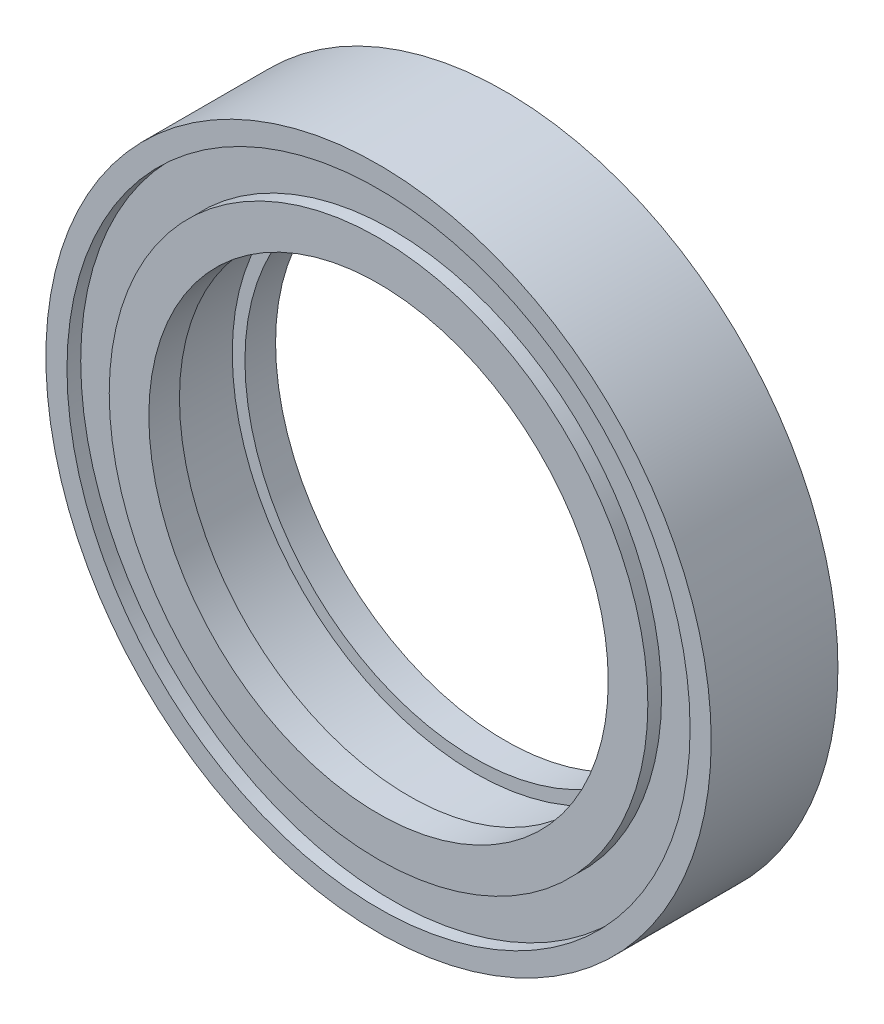
ISO-10303-21;
HEADER;
FILE_DESCRIPTION(('STEP AP214'),'2;1');
FILE_NAME('part.step','',(''),(''),'','','');
FILE_SCHEMA(('AUTOMOTIVE_DESIGN { 1 0 10303 214 1 1 1 1 }'));
ENDSEC;
DATA;
#1=APPLICATION_CONTEXT('core data for automotive mechanical design processes');
#2=APPLICATION_PROTOCOL_DEFINITION('international standard','automotive_design',2000,#1);
#3=PRODUCT_CONTEXT('',#1,'mechanical');
#4=PRODUCT('Part','Part','',(#3));
#5=PRODUCT_RELATED_PRODUCT_CATEGORY('part','',(#4));
#6=PRODUCT_DEFINITION_FORMATION('','',#4);
#7=PRODUCT_DEFINITION_CONTEXT('part definition',#1,'design');
#8=PRODUCT_DEFINITION('design','',#6,#7);
#9=PRODUCT_DEFINITION_SHAPE('','',#8);
#10=(LENGTH_UNIT() NAMED_UNIT(*) SI_UNIT(.MILLI.,.METRE.));
#11=(NAMED_UNIT(*) PLANE_ANGLE_UNIT() SI_UNIT($,.RADIAN.));
#12=(NAMED_UNIT(*) SI_UNIT($,.STERADIAN.) SOLID_ANGLE_UNIT());
#13=UNCERTAINTY_MEASURE_WITH_UNIT(LENGTH_MEASURE(1.E-05),#10,'distance_accuracy_value','');
#14=(GEOMETRIC_REPRESENTATION_CONTEXT(3) GLOBAL_UNCERTAINTY_ASSIGNED_CONTEXT((#13)) GLOBAL_UNIT_ASSIGNED_CONTEXT((#10,
#11,#12)) REPRESENTATION_CONTEXT('',''));
#15=CARTESIAN_POINT('',(0.,0.,0.));
#16=DIRECTION('',(0.,0.,1.));
#17=DIRECTION('',(1.,0.,0.));
#18=AXIS2_PLACEMENT_3D('',#15,#16,#17);
#19=CARTESIAN_POINT('',(3.43024899888577E-12,0.,1000.));
#20=DIRECTION('',(0.,0.,1.));
#21=DIRECTION('',(1.,0.,0.));
#22=AXIS2_PLACEMENT_3D('',#19,#20,#21);
#23=CYLINDRICAL_SURFACE('',#22,315.);
#24=CARTESIAN_POINT('',(2.05814939933142E-13,0.,59.9999999999989));
#25=DIRECTION('',(0.,0.,1.));
#26=DIRECTION('',(1.,0.,0.));
#27=AXIS2_PLACEMENT_3D('',#24,#25,#26);
#28=CIRCLE('',#27,315.);
#29=CARTESIAN_POINT('',(315.,0.,59.9999999999979));
#30=VERTEX_POINT('',#29);
#31=EDGE_CURVE('E87',#30,#30,#28,.T.);
#32=ORIENTED_EDGE('',*,*,#31,.F.);
#33=EDGE_LOOP('',(#32));
#34=FACE_BOUND('',#33,.T.);
#35=CARTESIAN_POINT('',(-2.0581493993315E-13,0.,-60.0000000000012));
#36=DIRECTION('',(0.,0.,1.));
#37=DIRECTION('',(1.,0.,0.));
#38=AXIS2_PLACEMENT_3D('',#35,#36,#37);
#39=CIRCLE('',#38,314.999999999999);
#40=CARTESIAN_POINT('',(314.999999999999,0.,-60.0000000000022));
#41=VERTEX_POINT('',#40);
#42=EDGE_CURVE('E10',#41,#41,#39,.T.);
#43=ORIENTED_EDGE('',*,*,#42,.T.);
#44=EDGE_LOOP('',(#43));
#45=FACE_BOUND('',#44,.T.);
#46=ADVANCED_FACE('F35',(#34,#45),#23,.T.);
#47=CARTESIAN_POINT('',(-315.,0.,-60.));
#48=DIRECTION('',(0.,0.,1.));
#49=DIRECTION('',(1.,0.,0.));
#50=AXIS2_PLACEMENT_3D('',#47,#48,#49);
#51=PLANE('',#50);
#52=ORIENTED_EDGE('',*,*,#42,.F.);
#53=EDGE_LOOP('',(#52));
#54=FACE_BOUND('',#53,.T.);
#55=CARTESIAN_POINT('',(-2.0581493993315E-13,0.,-60.0000000000012));
#56=DIRECTION('',(0.,0.,1.));
#57=DIRECTION('',(1.,0.,0.));
#58=AXIS2_PLACEMENT_3D('',#55,#56,#57);
#59=CIRCLE('',#58,294.999999999999);
#60=CARTESIAN_POINT('',(294.999999999999,0.,-60.0000000000022));
#61=VERTEX_POINT('',#60);
#62=EDGE_CURVE('E41',#61,#61,#59,.T.);
#63=ORIENTED_EDGE('',*,*,#62,.T.);
#64=EDGE_LOOP('',(#63));
#65=FACE_BOUND('',#64,.T.);
#66=ADVANCED_FACE('F94',(#54,#65),#51,.F.);
#67=CARTESIAN_POINT('',(3.43024899888577E-12,0.,1000.));
#68=DIRECTION('',(0.,0.,1.));
#69=DIRECTION('',(1.,0.,0.));
#70=AXIS2_PLACEMENT_3D('',#67,#68,#69);
#71=CYLINDRICAL_SURFACE('',#70,294.999999999999);
#72=ORIENTED_EDGE('',*,*,#62,.F.);
#73=EDGE_LOOP('',(#72));
#74=FACE_BOUND('',#73,.T.);
#75=CARTESIAN_POINT('',(-1.61221702947636E-13,0.,-47.0000000000015));
#76=DIRECTION('',(0.,0.,1.));
#77=DIRECTION('',(1.,0.,0.));
#78=AXIS2_PLACEMENT_3D('',#75,#76,#77);
#79=CIRCLE('',#78,294.999999999999);
#80=CARTESIAN_POINT('',(294.999999999999,0.,-47.0000000000025));
#81=VERTEX_POINT('',#80);
#82=EDGE_CURVE('E45',#81,#81,#79,.T.);
#83=ORIENTED_EDGE('',*,*,#82,.T.);
#84=EDGE_LOOP('',(#83));
#85=FACE_BOUND('',#84,.T.);
#86=ADVANCED_FACE('F98',(#74,#85),#71,.F.);
#87=CARTESIAN_POINT('',(-295.,0.,-47.0000000000002));
#88=DIRECTION('',(0.,0.,1.));
#89=DIRECTION('',(1.,0.,0.));
#90=AXIS2_PLACEMENT_3D('',#87,#88,#89);
#91=PLANE('',#90);
#92=ORIENTED_EDGE('',*,*,#82,.F.);
#93=EDGE_LOOP('',(#92));
#94=FACE_BOUND('',#93,.T.);
#95=CARTESIAN_POINT('',(-1.61221702947635E-13,0.,-47.0000000000013));
#96=DIRECTION('',(0.,0.,1.));
#97=DIRECTION('',(1.,0.,0.));
#98=AXIS2_PLACEMENT_3D('',#95,#96,#97);
#99=CIRCLE('',#98,255.);
#100=CARTESIAN_POINT('',(254.999999999999,0.,-47.0000000000021));
#101=VERTEX_POINT('',#100);
#102=EDGE_CURVE('E49',#101,#101,#99,.T.);
#103=ORIENTED_EDGE('',*,*,#102,.T.);
#104=EDGE_LOOP('',(#103));
#105=FACE_BOUND('',#104,.T.);
#106=ADVANCED_FACE('F103',(#94,#105),#91,.F.);
#107=CARTESIAN_POINT('',(3.43024899888577E-12,0.,1000.));
#108=DIRECTION('',(0.,0.,1.));
#109=DIRECTION('',(1.,0.,0.));
#110=AXIS2_PLACEMENT_3D('',#107,#108,#109);
#111=CYLINDRICAL_SURFACE('',#110,255.);
#112=ORIENTED_EDGE('',*,*,#102,.F.);
#113=EDGE_LOOP('',(#112));
#114=FACE_BOUND('',#113,.T.);
#115=CARTESIAN_POINT('',(-2.0581493993315E-13,0.,-60.0000000000009));
#116=DIRECTION('',(0.,0.,1.));
#117=DIRECTION('',(1.,0.,0.));
#118=AXIS2_PLACEMENT_3D('',#115,#116,#117);
#119=CIRCLE('',#118,255.);
#120=CARTESIAN_POINT('',(254.999999999999,0.,-60.0000000000018));
#121=VERTEX_POINT('',#120);
#122=EDGE_CURVE('E54',#121,#121,#119,.T.);
#123=ORIENTED_EDGE('',*,*,#122,.T.);
#124=EDGE_LOOP('',(#123));
#125=FACE_BOUND('',#124,.T.);
#126=ADVANCED_FACE('F109',(#114,#125),#111,.T.);
#127=CARTESIAN_POINT('',(-255.,0.,-59.9999999999999));
#128=DIRECTION('',(0.,0.,1.));
#129=DIRECTION('',(1.,0.,0.));
#130=AXIS2_PLACEMENT_3D('',#127,#128,#129);
#131=PLANE('',#130);
#132=ORIENTED_EDGE('',*,*,#122,.F.);
#133=EDGE_LOOP('',(#132));
#134=FACE_BOUND('',#133,.T.);
#135=CARTESIAN_POINT('',(-2.05814939933149E-13,0.,-60.0000000000007));
#136=DIRECTION('',(0.,0.,1.));
#137=DIRECTION('',(1.,0.,0.));
#138=AXIS2_PLACEMENT_3D('',#135,#136,#137);
#139=CIRCLE('',#138,217.499999999999);
#140=CARTESIAN_POINT('',(217.499999999999,0.,-60.0000000000015));
#141=VERTEX_POINT('',#140);
#142=EDGE_CURVE('E57',#141,#141,#139,.T.);
#143=ORIENTED_EDGE('',*,*,#142,.T.);
#144=EDGE_LOOP('',(#143));
#145=FACE_BOUND('',#144,.T.);
#146=ADVANCED_FACE('F113',(#134,#145),#131,.F.);
#147=CARTESIAN_POINT('',(3.43024899888577E-12,0.,1000.));
#148=DIRECTION('',(0.,0.,1.));
#149=DIRECTION('',(1.,0.,0.));
#150=AXIS2_PLACEMENT_3D('',#147,#148,#149);
#151=CYLINDRICAL_SURFACE('',#150,217.5);
#152=ORIENTED_EDGE('',*,*,#142,.F.);
#153=EDGE_LOOP('',(#152));
#154=FACE_BOUND('',#153,.T.);
#155=CARTESIAN_POINT('',(-1.06337718965461E-13,0.,-31.0000000000006));
#156=DIRECTION('',(0.,0.,1.));
#157=DIRECTION('',(1.,0.,0.));
#158=AXIS2_PLACEMENT_3D('',#155,#156,#157);
#159=CIRCLE('',#158,217.5);
#160=CARTESIAN_POINT('',(217.499999999999,0.,-31.0000000000013));
#161=VERTEX_POINT('',#160);
#162=EDGE_CURVE('E60',#161,#161,#159,.T.);
#163=ORIENTED_EDGE('',*,*,#162,.T.);
#164=EDGE_LOOP('',(#163));
#165=FACE_BOUND('',#164,.T.);
#166=ADVANCED_FACE('F117',(#154,#165),#151,.F.);
#167=CARTESIAN_POINT('',(-217.5,0.,-31.));
#168=DIRECTION('',(0.,0.,-1.));
#169=DIRECTION('',(-1.,0.,0.));
#170=AXIS2_PLACEMENT_3D('',#167,#168,#169);
#171=PLANE('',#170);
#172=ORIENTED_EDGE('',*,*,#162,.F.);
#173=EDGE_LOOP('',(#172));
#174=FACE_BOUND('',#173,.T.);
#175=CARTESIAN_POINT('',(-1.06337718965461E-13,0.,-31.0000000000008));
#176=DIRECTION('',(0.,0.,1.));
#177=DIRECTION('',(1.,0.,0.));
#178=AXIS2_PLACEMENT_3D('',#175,#176,#177);
#179=CIRCLE('',#178,229.5);
#180=CARTESIAN_POINT('',(229.499999999999,0.,-31.0000000000016));
#181=VERTEX_POINT('',#180);
#182=EDGE_CURVE('E63',#181,#181,#179,.T.);
#183=ORIENTED_EDGE('',*,*,#182,.T.);
#184=EDGE_LOOP('',(#183));
#185=FACE_BOUND('',#184,.T.);
#186=ADVANCED_FACE('F121',(#174,#185),#171,.F.);
#187=CARTESIAN_POINT('',(3.43024899888577E-12,0.,1000.));
#188=DIRECTION('',(0.,0.,1.));
#189=DIRECTION('',(1.,0.,0.));
#190=AXIS2_PLACEMENT_3D('',#187,#188,#189);
#191=CYLINDRICAL_SURFACE('',#190,229.5);
#192=ORIENTED_EDGE('',*,*,#182,.F.);
#193=EDGE_LOOP('',(#192));
#194=FACE_BOUND('',#193,.T.);
#195=CARTESIAN_POINT('',(1.06337718965456E-13,0.,30.9999999999993));
#196=DIRECTION('',(0.,0.,1.));
#197=DIRECTION('',(1.,0.,0.));
#198=AXIS2_PLACEMENT_3D('',#195,#196,#197);
#199=CIRCLE('',#198,229.5);
#200=CARTESIAN_POINT('',(229.5,0.,30.9999999999985));
#201=VERTEX_POINT('',#200);
#202=EDGE_CURVE('E66',#201,#201,#199,.T.);
#203=ORIENTED_EDGE('',*,*,#202,.T.);
#204=EDGE_LOOP('',(#203));
#205=FACE_BOUND('',#204,.T.);
#206=ADVANCED_FACE('F125',(#194,#205),#191,.F.);
#207=CARTESIAN_POINT('',(-229.5,0.,31.));
#208=DIRECTION('',(0.,0.,1.));
#209=DIRECTION('',(1.,0.,0.));
#210=AXIS2_PLACEMENT_3D('',#207,#208,#209);
#211=PLANE('',#210);
#212=ORIENTED_EDGE('',*,*,#202,.F.);
#213=EDGE_LOOP('',(#212));
#214=FACE_BOUND('',#213,.T.);
#215=CARTESIAN_POINT('',(1.06337718965456E-13,0.,30.9999999999993));
#216=DIRECTION('',(0.,0.,1.));
#217=DIRECTION('',(1.,0.,0.));
#218=AXIS2_PLACEMENT_3D('',#215,#216,#217);
#219=CIRCLE('',#218,217.5);
#220=CARTESIAN_POINT('',(217.5,0.,30.9999999999985));
#221=VERTEX_POINT('',#220);
#222=EDGE_CURVE('E69',#221,#221,#219,.T.);
#223=ORIENTED_EDGE('',*,*,#222,.T.);
#224=EDGE_LOOP('',(#223));
#225=FACE_BOUND('',#224,.T.);
#226=ADVANCED_FACE('F129',(#214,#225),#211,.F.);
#227=CARTESIAN_POINT('',(3.43024899888577E-12,0.,1000.));
#228=DIRECTION('',(0.,0.,1.));
#229=DIRECTION('',(1.,0.,0.));
#230=AXIS2_PLACEMENT_3D('',#227,#228,#229);
#231=CYLINDRICAL_SURFACE('',#230,217.5);
#232=ORIENTED_EDGE('',*,*,#222,.F.);
#233=EDGE_LOOP('',(#232));
#234=FACE_BOUND('',#233,.T.);
#235=CARTESIAN_POINT('',(2.05814939933143E-13,0.,59.9999999999992));
#236=DIRECTION('',(0.,0.,1.));
#237=DIRECTION('',(1.,0.,0.));
#238=AXIS2_PLACEMENT_3D('',#235,#236,#237);
#239=CIRCLE('',#238,217.5);
#240=CARTESIAN_POINT('',(217.5,0.,59.9999999999984));
#241=VERTEX_POINT('',#240);
#242=EDGE_CURVE('E72',#241,#241,#239,.T.);
#243=ORIENTED_EDGE('',*,*,#242,.T.);
#244=EDGE_LOOP('',(#243));
#245=FACE_BOUND('',#244,.T.);
#246=ADVANCED_FACE('F133',(#234,#245),#231,.F.);
#247=CARTESIAN_POINT('',(-217.5,0.,59.9999999999999));
#248=DIRECTION('',(0.,0.,-1.));
#249=DIRECTION('',(-1.,0.,0.));
#250=AXIS2_PLACEMENT_3D('',#247,#248,#249);
#251=PLANE('',#250);
#252=ORIENTED_EDGE('',*,*,#242,.F.);
#253=EDGE_LOOP('',(#252));
#254=FACE_BOUND('',#253,.T.);
#255=CARTESIAN_POINT('',(2.05814939933143E-13,0.,59.9999999999992));
#256=DIRECTION('',(0.,0.,1.));
#257=DIRECTION('',(1.,0.,0.));
#258=AXIS2_PLACEMENT_3D('',#255,#256,#257);
#259=CIRCLE('',#258,255.);
#260=CARTESIAN_POINT('',(255.,0.,59.9999999999983));
#261=VERTEX_POINT('',#260);
#262=EDGE_CURVE('E75',#261,#261,#259,.T.);
#263=ORIENTED_EDGE('',*,*,#262,.T.);
#264=EDGE_LOOP('',(#263));
#265=FACE_BOUND('',#264,.T.);
#266=ADVANCED_FACE('F137',(#254,#265),#251,.F.);
#267=CARTESIAN_POINT('',(3.43024899888577E-12,0.,1000.));
#268=DIRECTION('',(0.,0.,1.));
#269=DIRECTION('',(1.,0.,0.));
#270=AXIS2_PLACEMENT_3D('',#267,#268,#269);
#271=CYLINDRICAL_SURFACE('',#270,255.);
#272=ORIENTED_EDGE('',*,*,#262,.F.);
#273=EDGE_LOOP('',(#272));
#274=FACE_BOUND('',#273,.T.);
#275=CARTESIAN_POINT('',(1.61221702947628E-13,0.,46.9999999999992));
#276=DIRECTION('',(0.,0.,1.));
#277=DIRECTION('',(1.,0.,0.));
#278=AXIS2_PLACEMENT_3D('',#275,#276,#277);
#279=CIRCLE('',#278,255.);
#280=CARTESIAN_POINT('',(255.,0.,46.9999999999983));
#281=VERTEX_POINT('',#280);
#282=EDGE_CURVE('E78',#281,#281,#279,.T.);
#283=ORIENTED_EDGE('',*,*,#282,.T.);
#284=EDGE_LOOP('',(#283));
#285=FACE_BOUND('',#284,.T.);
#286=ADVANCED_FACE('F141',(#274,#285),#271,.T.);
#287=CARTESIAN_POINT('',(-255.,0.,46.9999999999999));
#288=DIRECTION('',(0.,0.,-1.));
#289=DIRECTION('',(-1.,0.,0.));
#290=AXIS2_PLACEMENT_3D('',#287,#288,#289);
#291=PLANE('',#290);
#292=ORIENTED_EDGE('',*,*,#282,.F.);
#293=EDGE_LOOP('',(#292));
#294=FACE_BOUND('',#293,.T.);
#295=CARTESIAN_POINT('',(1.61221702947628E-13,0.,46.999999999999));
#296=DIRECTION('',(0.,0.,1.));
#297=DIRECTION('',(1.,0.,0.));
#298=AXIS2_PLACEMENT_3D('',#295,#296,#297);
#299=CIRCLE('',#298,295.);
#300=CARTESIAN_POINT('',(295.,0.,46.999999999998));
#301=VERTEX_POINT('',#300);
#302=EDGE_CURVE('E81',#301,#301,#299,.T.);
#303=ORIENTED_EDGE('',*,*,#302,.T.);
#304=EDGE_LOOP('',(#303));
#305=FACE_BOUND('',#304,.T.);
#306=ADVANCED_FACE('F145',(#294,#305),#291,.F.);
#307=CARTESIAN_POINT('',(3.43024899888577E-12,0.,1000.));
#308=DIRECTION('',(0.,0.,1.));
#309=DIRECTION('',(1.,0.,0.));
#310=AXIS2_PLACEMENT_3D('',#307,#308,#309);
#311=CYLINDRICAL_SURFACE('',#310,295.);
#312=ORIENTED_EDGE('',*,*,#302,.F.);
#313=EDGE_LOOP('',(#312));
#314=FACE_BOUND('',#313,.T.);
#315=CARTESIAN_POINT('',(2.05814939933143E-13,0.,59.9999999999991));
#316=DIRECTION('',(0.,0.,1.));
#317=DIRECTION('',(1.,0.,0.));
#318=AXIS2_PLACEMENT_3D('',#315,#316,#317);
#319=CIRCLE('',#318,295.);
#320=CARTESIAN_POINT('',(295.,0.,59.999999999998));
#321=VERTEX_POINT('',#320);
#322=EDGE_CURVE('E84',#321,#321,#319,.T.);
#323=ORIENTED_EDGE('',*,*,#322,.T.);
#324=EDGE_LOOP('',(#323));
#325=FACE_BOUND('',#324,.T.);
#326=ADVANCED_FACE('F149',(#314,#325),#311,.F.);
#327=CARTESIAN_POINT('',(-294.999999999999,0.,60.));
#328=DIRECTION('',(0.,0.,-1.));
#329=DIRECTION('',(-1.,0.,0.));
#330=AXIS2_PLACEMENT_3D('',#327,#328,#329);
#331=PLANE('',#330);
#332=ORIENTED_EDGE('',*,*,#322,.F.);
#333=EDGE_LOOP('',(#332));
#334=FACE_BOUND('',#333,.T.);
#335=ORIENTED_EDGE('',*,*,#31,.T.);
#336=EDGE_LOOP('',(#335));
#337=FACE_BOUND('',#336,.T.);
#338=ADVANCED_FACE('F91',(#334,#337),#331,.F.);
#339=CLOSED_SHELL('',(#46,#66,#86,#106,#126,#146,#166,#186,#206,#226,#246,#266,#286,#306,#326,#338));
#340=MANIFOLD_SOLID_BREP('B2',#339);
#341=ADVANCED_BREP_SHAPE_REPRESENTATION('',(#18,#340),#14);
#342=SHAPE_DEFINITION_REPRESENTATION(#9,#341);
ENDSEC;
END-ISO-10303-21;
